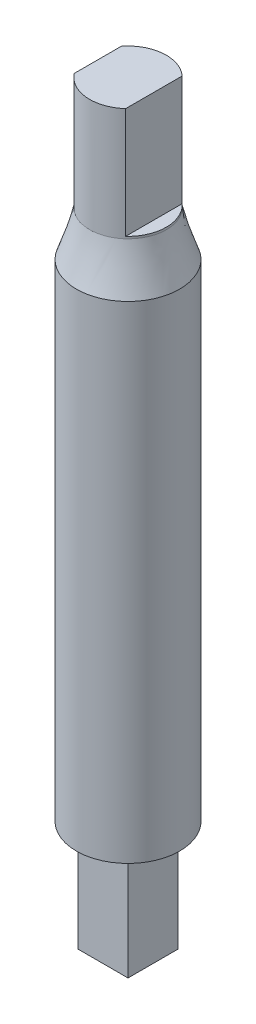
ISO-10303-21;
HEADER;
FILE_DESCRIPTION(('STEP AP214'),'2;1');
FILE_NAME('part.step','',(''),(''),'','','');
FILE_SCHEMA(('AUTOMOTIVE_DESIGN { 1 0 10303 214 1 1 1 1 }'));
ENDSEC;
DATA;
#1=APPLICATION_CONTEXT('core data for automotive mechanical design processes');
#2=APPLICATION_PROTOCOL_DEFINITION('international standard','automotive_design',2000,#1);
#3=PRODUCT_CONTEXT('',#1,'mechanical');
#4=PRODUCT('Part','Part','',(#3));
#5=PRODUCT_RELATED_PRODUCT_CATEGORY('part','',(#4));
#6=PRODUCT_DEFINITION_FORMATION('','',#4);
#7=PRODUCT_DEFINITION_CONTEXT('part definition',#1,'design');
#8=PRODUCT_DEFINITION('design','',#6,#7);
#9=PRODUCT_DEFINITION_SHAPE('','',#8);
#10=(LENGTH_UNIT() NAMED_UNIT(*) SI_UNIT(.MILLI.,.METRE.));
#11=(NAMED_UNIT(*) PLANE_ANGLE_UNIT() SI_UNIT($,.RADIAN.));
#12=(NAMED_UNIT(*) SI_UNIT($,.STERADIAN.) SOLID_ANGLE_UNIT());
#13=UNCERTAINTY_MEASURE_WITH_UNIT(LENGTH_MEASURE(1.E-05),#10,'distance_accuracy_value','');
#14=(GEOMETRIC_REPRESENTATION_CONTEXT(3) GLOBAL_UNCERTAINTY_ASSIGNED_CONTEXT((#13)) GLOBAL_UNIT_ASSIGNED_CONTEXT((#10,
#11,#12)) REPRESENTATION_CONTEXT('',''));
#15=CARTESIAN_POINT('',(0.,0.,0.));
#16=DIRECTION('',(0.,0.,1.));
#17=DIRECTION('',(1.,0.,0.));
#18=AXIS2_PLACEMENT_3D('',#15,#16,#17);
#19=CARTESIAN_POINT('',(0.,0.,0.));
#20=DIRECTION('',(0.,1.,0.));
#21=DIRECTION('',(0.,0.,1.));
#22=AXIS2_PLACEMENT_3D('',#19,#20,#21);
#23=PLANE('',#22);
#24=CARTESIAN_POINT('',(0.,0.,0.));
#25=DIRECTION('',(0.,1.,0.));
#26=DIRECTION('',(0.,0.,1.));
#27=AXIS2_PLACEMENT_3D('',#24,#25,#26);
#28=CIRCLE('',#27,3.5);
#29=CARTESIAN_POINT('',(0.,0.,3.5));
#30=VERTEX_POINT('',#29);
#31=EDGE_CURVE('E53',#30,#30,#28,.T.);
#32=ORIENTED_EDGE('',*,*,#31,.F.);
#33=EDGE_LOOP('',(#32));
#34=FACE_BOUND('',#33,.T.);
#35=DIRECTION('',(0.,0.,1.));
#36=VECTOR('',#35,1.);
#37=CARTESIAN_POINT('',(1.7,0.,1.7));
#38=LINE('',#37,#36);
#39=CARTESIAN_POINT('',(1.7,0.,-1.7));
#40=VERTEX_POINT('',#39);
#41=CARTESIAN_POINT('',(1.7,0.,1.7));
#42=VERTEX_POINT('',#41);
#43=EDGE_CURVE('E60',#40,#42,#38,.T.);
#44=ORIENTED_EDGE('',*,*,#43,.F.);
#45=DIRECTION('',(1.,0.,0.));
#46=VECTOR('',#45,1.);
#47=CARTESIAN_POINT('',(-1.7,0.,-1.7));
#48=LINE('',#47,#46);
#49=CARTESIAN_POINT('',(-1.7,0.,-1.7));
#50=VERTEX_POINT('',#49);
#51=EDGE_CURVE('E64',#50,#40,#48,.T.);
#52=ORIENTED_EDGE('',*,*,#51,.F.);
#53=DIRECTION('',(0.,0.,-1.));
#54=VECTOR('',#53,1.);
#55=CARTESIAN_POINT('',(-1.7,0.,1.7));
#56=LINE('',#55,#54);
#57=CARTESIAN_POINT('',(-1.7,0.,1.7));
#58=VERTEX_POINT('',#57);
#59=EDGE_CURVE('E333',#58,#50,#56,.T.);
#60=ORIENTED_EDGE('',*,*,#59,.F.);
#61=DIRECTION('',(-1.,0.,0.));
#62=VECTOR('',#61,1.);
#63=CARTESIAN_POINT('',(-1.7,0.,1.7));
#64=LINE('',#63,#62);
#65=EDGE_CURVE('E339',#42,#58,#64,.T.);
#66=ORIENTED_EDGE('',*,*,#65,.F.);
#67=EDGE_LOOP('',(#44,#52,#60,#66));
#68=FACE_BOUND('',#67,.T.);
#69=ADVANCED_FACE('F44',(#34,#68),#23,.F.);
#70=CARTESIAN_POINT('',(0.,36.19,0.));
#71=DIRECTION('',(0.,1.,0.));
#72=DIRECTION('',(0.,0.,1.));
#73=AXIS2_PLACEMENT_3D('',#70,#71,#72);
#74=PLANE('',#73);
#75=CARTESIAN_POINT('',(0.,36.19,0.));
#76=DIRECTION('',(0.,1.,0.));
#77=DIRECTION('',(0.,0.,1.));
#78=AXIS2_PLACEMENT_3D('',#75,#76,#77);
#79=CIRCLE('',#78,2.6);
#80=CARTESIAN_POINT('',(1.75818565571523,36.19,1.91540679753342));
#81=VERTEX_POINT('',#80);
#82=CARTESIAN_POINT('',(1.75818565571523,36.19,-1.91540679753342));
#83=VERTEX_POINT('',#82);
#84=EDGE_CURVE('E159',#81,#83,#79,.T.);
#85=ORIENTED_EDGE('',*,*,#84,.T.);
#86=DIRECTION('',(0.,0.,-1.));
#87=VECTOR('',#86,1.);
#88=CARTESIAN_POINT('',(1.75818565571523,36.19,1.91540679753342));
#89=LINE('',#88,#87);
#90=EDGE_CURVE('E143',#81,#83,#89,.T.);
#91=ORIENTED_EDGE('',*,*,#90,.F.);
#92=EDGE_LOOP('',(#85,#91));
#93=FACE_BOUND('',#92,.T.);
#94=ADVANCED_FACE('F183',(#93),#74,.T.);
#95=CARTESIAN_POINT('',(0.,36.19,0.));
#96=DIRECTION('',(0.,-1.,0.));
#97=DIRECTION('',(0.,0.,-1.));
#98=AXIS2_PLACEMENT_3D('',#95,#96,#97);
#99=CYLINDRICAL_SURFACE('',#98,2.6);
#100=CARTESIAN_POINT('',(0.,36.0399588896741,0.));
#101=DIRECTION('',(0.,1.,0.));
#102=DIRECTION('',(0.,0.,1.));
#103=AXIS2_PLACEMENT_3D('',#100,#101,#102);
#104=CIRCLE('',#103,2.6);
#105=CARTESIAN_POINT('',(1.40755948208582,36.0399588896741,2.1860412403224));
#106=VERTEX_POINT('',#105);
#107=EDGE_CURVE('E130',#106,#106,#104,.T.);
#108=ORIENTED_EDGE('',*,*,#107,.T.);
#109=EDGE_LOOP('',(#108));
#110=FACE_BOUND('',#109,.T.);
#111=ORIENTED_EDGE('',*,*,#84,.F.);
#112=DIRECTION('',(0.,-1.,0.));
#113=VECTOR('',#112,1.);
#114=CARTESIAN_POINT('',(1.75818565571523,43.69,1.91540679753342));
#115=LINE('',#114,#113);
#116=CARTESIAN_POINT('',(1.75818565571523,43.69,1.91540679753342));
#117=VERTEX_POINT('',#116);
#118=EDGE_CURVE('E169',#117,#81,#115,.T.);
#119=ORIENTED_EDGE('',*,*,#118,.F.);
#120=CARTESIAN_POINT('',(0.,43.69,0.));
#121=DIRECTION('',(0.,1.,0.));
#122=DIRECTION('',(0.,0.,1.));
#123=AXIS2_PLACEMENT_3D('',#120,#121,#122);
#124=CIRCLE('',#123,2.6);
#125=CARTESIAN_POINT('',(-2.05181434428477,43.69,1.59689007028889));
#126=VERTEX_POINT('',#125);
#127=EDGE_CURVE('E145',#126,#117,#124,.T.);
#128=ORIENTED_EDGE('',*,*,#127,.F.);
#129=DIRECTION('',(0.,-1.,0.));
#130=VECTOR('',#129,1.);
#131=CARTESIAN_POINT('',(-2.05181434428477,43.69,1.59689007028889));
#132=LINE('',#131,#130);
#133=CARTESIAN_POINT('',(-2.05181434428477,36.19,1.59689007028889));
#134=VERTEX_POINT('',#133);
#135=EDGE_CURVE('E166',#126,#134,#132,.T.);
#136=ORIENTED_EDGE('',*,*,#135,.T.);
#137=CARTESIAN_POINT('',(-2.05181434428477,36.19,-1.59689007028889));
#138=VERTEX_POINT('',#137);
#139=EDGE_CURVE('E162',#138,#134,#79,.T.);
#140=ORIENTED_EDGE('',*,*,#139,.F.);
#141=DIRECTION('',(0.,-1.,0.));
#142=VECTOR('',#141,1.);
#143=CARTESIAN_POINT('',(-2.05181434428477,43.69,-1.59689007028889));
#144=LINE('',#143,#142);
#145=CARTESIAN_POINT('',(-2.05181434428477,43.69,-1.59689007028889));
#146=VERTEX_POINT('',#145);
#147=EDGE_CURVE('E163',#146,#138,#144,.T.);
#148=ORIENTED_EDGE('',*,*,#147,.F.);
#149=CARTESIAN_POINT('',(0.,43.69,0.));
#150=DIRECTION('',(0.,1.,0.));
#151=DIRECTION('',(0.,0.,1.));
#152=AXIS2_PLACEMENT_3D('',#149,#150,#151);
#153=CIRCLE('',#152,2.6);
#154=CARTESIAN_POINT('',(1.75818565571523,43.69,-1.91540679753342));
#155=VERTEX_POINT('',#154);
#156=EDGE_CURVE('E139',#155,#146,#153,.T.);
#157=ORIENTED_EDGE('',*,*,#156,.F.);
#158=DIRECTION('',(0.,-1.,0.));
#159=VECTOR('',#158,1.);
#160=CARTESIAN_POINT('',(1.75818565571523,43.69,-1.91540679753342));
#161=LINE('',#160,#159);
#162=EDGE_CURVE('E149',#155,#83,#161,.T.);
#163=ORIENTED_EDGE('',*,*,#162,.T.);
#164=EDGE_LOOP('',(#111,#119,#128,#136,#140,#148,#157,#163));
#165=FACE_BOUND('',#164,.T.);
#166=ADVANCED_FACE('F176',(#110,#165),#99,.T.);
#167=ORIENTED_EDGE('',*,*,#139,.T.);
#168=DIRECTION('',(0.,0.,1.));
#169=VECTOR('',#168,1.);
#170=CARTESIAN_POINT('',(-2.05181434428477,36.19,-1.59689007028889));
#171=LINE('',#170,#169);
#172=EDGE_CURVE('E133',#138,#134,#171,.T.);
#173=ORIENTED_EDGE('',*,*,#172,.F.);
#174=EDGE_LOOP('',(#167,#173));
#175=FACE_BOUND('',#174,.T.);
#176=ADVANCED_FACE('F186',(#175),#74,.T.);
#177=CARTESIAN_POINT('',(-2.05181434428477,43.69,-1.59689007028889));
#178=DIRECTION('',(1.,0.,0.));
#179=DIRECTION('',(0.,0.,-1.));
#180=AXIS2_PLACEMENT_3D('',#177,#178,#179);
#181=PLANE('',#180);
#182=ORIENTED_EDGE('',*,*,#172,.T.);
#183=ORIENTED_EDGE('',*,*,#135,.F.);
#184=DIRECTION('',(0.,0.,1.));
#185=VECTOR('',#184,1.);
#186=CARTESIAN_POINT('',(-2.05181434428477,43.69,-1.59689007028889));
#187=LINE('',#186,#185);
#188=EDGE_CURVE('E142',#146,#126,#187,.T.);
#189=ORIENTED_EDGE('',*,*,#188,.F.);
#190=ORIENTED_EDGE('',*,*,#147,.T.);
#191=EDGE_LOOP('',(#182,#183,#189,#190));
#192=FACE_BOUND('',#191,.T.);
#193=ADVANCED_FACE('F197',(#192),#181,.F.);
#194=CARTESIAN_POINT('',(1.75818565571523,43.69,1.91540679753342));
#195=DIRECTION('',(-1.,0.,0.));
#196=DIRECTION('',(0.,0.,1.));
#197=AXIS2_PLACEMENT_3D('',#194,#195,#196);
#198=PLANE('',#197);
#199=ORIENTED_EDGE('',*,*,#90,.T.);
#200=ORIENTED_EDGE('',*,*,#162,.F.);
#201=DIRECTION('',(0.,0.,-1.));
#202=VECTOR('',#201,1.);
#203=CARTESIAN_POINT('',(1.75818565571523,43.69,1.91540679753342));
#204=LINE('',#203,#202);
#205=EDGE_CURVE('E147',#117,#155,#204,.T.);
#206=ORIENTED_EDGE('',*,*,#205,.F.);
#207=ORIENTED_EDGE('',*,*,#118,.T.);
#208=EDGE_LOOP('',(#199,#200,#206,#207));
#209=FACE_BOUND('',#208,.T.);
#210=ADVANCED_FACE('F181',(#209),#198,.F.);
#211=CARTESIAN_POINT('',(0.,43.69,0.));
#212=DIRECTION('',(0.,1.,0.));
#213=DIRECTION('',(0.,0.,1.));
#214=AXIS2_PLACEMENT_3D('',#211,#212,#213);
#215=PLANE('',#214);
#216=ORIENTED_EDGE('',*,*,#156,.T.);
#217=ORIENTED_EDGE('',*,*,#188,.T.);
#218=ORIENTED_EDGE('',*,*,#127,.T.);
#219=ORIENTED_EDGE('',*,*,#205,.T.);
#220=EDGE_LOOP('',(#216,#217,#218,#219));
#221=FACE_BOUND('',#220,.T.);
#222=ADVANCED_FACE('F208',(#221),#215,.T.);
#223=CARTESIAN_POINT('',(0.603918100609763,33.,3.44750386914299));
#224=CARTESIAN_POINT('',(1.44722424386601,36.19,2.12378011761257));
#225=CARTESIAN_POINT('',(7.49892583889575,33.,2.23966766792346));
#226=CARTESIAN_POINT('',(5.69478447909114,36.19,-0.770668370119461));
#227=CARTESIAN_POINT('',(6.29108963767622,33.,-4.65534007036252));
#228=CARTESIAN_POINT('',(2.80033599135912,36.19,-5.01822860534459));
#229=CARTESIAN_POINT('',(-0.603918100609763,33.,-3.44750386914299));
#230=CARTESIAN_POINT('',(-1.44722424386601,36.19,-2.12378011761257));
#231=CARTESIAN_POINT('',(-7.49892583889575,33.,-2.23966766792347));
#232=CARTESIAN_POINT('',(-5.69478447909115,36.19,0.770668370119462));
#233=CARTESIAN_POINT('',(-6.29108963767622,33.,4.65534007036252));
#234=CARTESIAN_POINT('',(-2.80033599135912,36.19,5.0182286053446));
#235=CARTESIAN_POINT('',(0.603918100609763,33.,3.44750386914299));
#236=CARTESIAN_POINT('',(1.44722424386601,36.19,2.12378011761257));
#237=(BOUNDED_SURFACE() B_SPLINE_SURFACE(3,1,((#223,#224),(#225,#226),(#227,#228),(#229,#230),
(#231,#232),(#233,#234),(#235,#236)),.UNSPECIFIED.,.T.,.F.,.F.) B_SPLINE_SURFACE_WITH_KNOTS((4,
3,4),(2,2),(0.,0.5,1.),(0.,1.),
.UNSPECIFIED.) GEOMETRIC_REPRESENTATION_ITEM() RATIONAL_B_SPLINE_SURFACE(((1.,1.),
(0.333333333333333,0.333333333333333),(0.333333333333333,0.333333333333333),(1.,1.),
(0.333333333333333,0.333333333333333),(0.333333333333333,0.333333333333333),(1.,1.))) REPRESENTATION_ITEM('') SURFACE());
#238=CARTESIAN_POINT('',(0.,33.,0.));
#239=DIRECTION('',(0.,-1.,0.));
#240=DIRECTION('',(0.,0.,-1.));
#241=AXIS2_PLACEMENT_3D('',#238,#239,#240);
#242=CIRCLE('',#241,3.5);
#243=CARTESIAN_POINT('',(0.603918100609763,33.,3.44750386914299));
#244=VERTEX_POINT('',#243);
#245=EDGE_CURVE('E12',#244,#244,#242,.F.);
#246=CARTESIAN_POINT('',(0.603918100609763,33.,3.44750386914299));
#247=CARTESIAN_POINT('',(0.612289365000139,33.0316662384341,3.43436363342611));
#248=CARTESIAN_POINT('',(0.620660629390515,33.0633324768682,3.42122339770923));
#249=CARTESIAN_POINT('',(0.637403158171266,33.1266649537364,3.39494292627547));
#250=CARTESIAN_POINT('',(0.645774422561641,33.1583311921705,3.38180269055859));
#251=CARTESIAN_POINT('',(0.662516951342393,33.2216636690387,3.35552221912482));
#252=CARTESIAN_POINT('',(0.670888215732768,33.2533299074728,3.34238198340794));
#253=CARTESIAN_POINT('',(0.68763074451352,33.3166623843411,3.31610151197418));
#254=CARTESIAN_POINT('',(0.696002008903895,33.3483286227752,3.3029612762573));
#255=CARTESIAN_POINT('',(0.712744537684646,33.4116610996434,3.27668080482354));
#256=CARTESIAN_POINT('',(0.721115802075022,33.4433273380775,3.26354056910666));
#257=CARTESIAN_POINT('',(0.737858330855773,33.5066598149457,3.23726009767289));
#258=CARTESIAN_POINT('',(0.746229595246149,33.5383260533798,3.22411986195601));
#259=CARTESIAN_POINT('',(0.7629721240269,33.601658530248,3.19783939052225));
#260=CARTESIAN_POINT('',(0.771343388417276,33.6333247686821,3.18469915480537));
#261=CARTESIAN_POINT('',(0.788085917198027,33.6966572455503,3.15841868337161));
#262=CARTESIAN_POINT('',(0.796457181588402,33.7283234839844,3.14527844765473));
#263=CARTESIAN_POINT('',(0.813199710369154,33.7916559608526,3.11899797622096));
#264=CARTESIAN_POINT('',(0.821570974759529,33.8233221992867,3.10585774050408));
#265=CARTESIAN_POINT('',(0.838313503540281,33.8866546761549,3.07957726907032));
#266=CARTESIAN_POINT('',(0.846684767930657,33.9183209145891,3.06643703335344));
#267=CARTESIAN_POINT('',(0.863427296711407,33.9816533914573,3.04015656191968));
#268=CARTESIAN_POINT('',(0.871798561101782,34.0133196298914,3.0270163262028));
#269=CARTESIAN_POINT('',(0.888541089882534,34.0766521067596,3.00073585476903));
#270=CARTESIAN_POINT('',(0.89691235427291,34.1083183451937,2.98759561905215));
#271=CARTESIAN_POINT('',(0.913654883053662,34.1716508220619,2.96131514761839));
#272=CARTESIAN_POINT('',(0.922026147444036,34.203317060496,2.94817491190151));
#273=CARTESIAN_POINT('',(0.938768676224788,34.2666495373642,2.92189444046775));
#274=CARTESIAN_POINT('',(0.947139940615164,34.2983157757983,2.90875420475086));
#275=CARTESIAN_POINT('',(0.963882469395915,34.3616482526665,2.8824737333171));
#276=CARTESIAN_POINT('',(0.97225373378629,34.3933144911006,2.86933349760022));
#277=CARTESIAN_POINT('',(0.988996262567041,34.4566469679689,2.84305302616646));
#278=CARTESIAN_POINT('',(0.997367526957418,34.4883132064029,2.82991279044958));
#279=CARTESIAN_POINT('',(1.01411005573817,34.5516456832712,2.80363231901581));
#280=CARTESIAN_POINT('',(1.02248132012854,34.5833119217053,2.79049208329893));
#281=CARTESIAN_POINT('',(1.0392238489093,34.6466443985735,2.76421161186517));
#282=CARTESIAN_POINT('',(1.04759511329967,34.6783106370076,2.75107137614829));
#283=CARTESIAN_POINT('',(1.06433764208042,34.7416431138758,2.72479090471453));
#284=CARTESIAN_POINT('',(1.0727089064708,34.7733093523099,2.71165066899765));
#285=CARTESIAN_POINT('',(1.08945143525155,34.8366418291781,2.68537019756388));
#286=CARTESIAN_POINT('',(1.09782269964192,34.8683080676122,2.672229961847));
#287=CARTESIAN_POINT('',(1.11456522842268,34.9316405444804,2.64594949041324));
#288=CARTESIAN_POINT('',(1.12293649281305,34.9633067829145,2.63280925469636));
#289=CARTESIAN_POINT('',(1.1396790215938,35.0266392597827,2.6065287832626));
#290=CARTESIAN_POINT('',(1.14805028598418,35.0583054982168,2.59338854754572));
#291=CARTESIAN_POINT('',(1.16479281476493,35.1216379750851,2.56710807611195));
#292=CARTESIAN_POINT('',(1.17316407915531,35.1533042135192,2.55396784039507));
#293=CARTESIAN_POINT('',(1.18990660793606,35.2166366903874,2.52768736896131));
#294=CARTESIAN_POINT('',(1.19827787232643,35.2483029288215,2.51454713324443));
#295=CARTESIAN_POINT('',(1.21502040110718,35.3116354056897,2.48826666181067));
#296=CARTESIAN_POINT('',(1.22339166549756,35.3433016441238,2.47512642609379));
#297=CARTESIAN_POINT('',(1.24013419427831,35.406634120992,2.44884595466002));
#298=CARTESIAN_POINT('',(1.24850545866869,35.4383003594261,2.43570571894314));
#299=CARTESIAN_POINT('',(1.26524798744944,35.5016328362943,2.40942524750938));
#300=CARTESIAN_POINT('',(1.27361925183981,35.5332990747284,2.3962850117925));
#301=CARTESIAN_POINT('',(1.29036178062056,35.5966315515966,2.37000454035874));
#302=CARTESIAN_POINT('',(1.29873304501094,35.6282977900307,2.35686430464186));
#303=CARTESIAN_POINT('',(1.31547557379169,35.691630266899,2.33058383320809));
#304=CARTESIAN_POINT('',(1.32384683818207,35.7232965053331,2.31744359749121));
#305=CARTESIAN_POINT('',(1.34058936696282,35.7866289822013,2.29116312605745));
#306=CARTESIAN_POINT('',(1.34896063135319,35.8182952206354,2.27802289034057));
#307=CARTESIAN_POINT('',(1.36570316013394,35.8816276975036,2.25174241890681));
#308=CARTESIAN_POINT('',(1.37407442452432,35.9132939359377,2.23860218318993));
#309=CARTESIAN_POINT('',(1.39081695330507,35.9766264128059,2.21232171175616));
#310=CARTESIAN_POINT('',(1.39918821769545,36.00829265124,2.19918147603928));
#311=CARTESIAN_POINT('',(1.40755948208582,36.0399588896741,2.1860412403224));
#312=B_SPLINE_CURVE_WITH_KNOTS('',3,(#246,#247,#248,#249,#250,#251,#252,#253,#254,#255,#256,
#257,#258,#259,#260,#261,#262,#263,#264,#265,#266,#267,#268,#269,#270,#271,#272,#273,#274,#275,
#276,#277,#278,#279,#280,#281,#282,#283,#284,#285,#286,#287,#288,#289,#290,#291,#292,#293,#294,
#295,#296,#297,#298,#299,#300,#301,#302,#303,#304,#305,#306,#307,#308,#309,#310,#311),
.UNSPECIFIED.,.F.,.F.,(4,2,2,2,2,2,2,2,2,2,2,2,2,2,2,2,2,2,2,2,2,2,2,2,2,2,2,2,2,2,2,2,4),(0.,
0.105874693240592,0.211749386481184,0.317624079721776,0.423498772962368,0.52937346620296,
0.635248159443553,0.741122852684145,0.846997545924737,0.952872239165323,1.05874693240591,
1.16462162564651,1.2704963188871,1.3763710121277,1.48224570536828,1.58812039860888,
1.69399509184947,1.79986978509007,1.90574447833065,2.01161917157124,2.11749386481184,
2.22336855805243,2.32924325129302,2.43511794453361,2.5409926377742,2.6468673310148,
2.75274202425539,2.85861671749598,2.96449141073657,3.07036610397716,3.17624079721776,
3.28211549045835,3.38799018369893),.UNSPECIFIED.);
#313=EDGE_CURVE('BSEAM209',#244,#106,#312,.T.);
#314=ORIENTED_EDGE('',*,*,#245,.T.);
#315=ORIENTED_EDGE('',*,*,#107,.F.);
#316=ORIENTED_EDGE('',*,*,#313,.T.);
#317=ORIENTED_EDGE('',*,*,#313,.F.);
#318=EDGE_LOOP('',(#314,#316,#315,#317));
#319=FACE_BOUND('',#318,.T.);
#320=ADVANCED_FACE('F209',(#319),#237,.T.);
#321=CARTESIAN_POINT('',(0.,33.,0.));
#322=DIRECTION('',(0.,-1.,0.));
#323=DIRECTION('',(0.,0.,-1.));
#324=AXIS2_PLACEMENT_3D('',#321,#322,#323);
#325=CYLINDRICAL_SURFACE('',#324,3.5);
#326=ORIENTED_EDGE('',*,*,#245,.F.);
#327=EDGE_LOOP('',(#326));
#328=FACE_BOUND('',#327,.T.);
#329=ORIENTED_EDGE('',*,*,#31,.T.);
#330=EDGE_LOOP('',(#329));
#331=FACE_BOUND('',#330,.T.);
#332=ADVANCED_FACE('F46',(#328,#331),#325,.T.);
#333=CARTESIAN_POINT('',(1.7,-7.5,1.7));
#334=DIRECTION('',(-1.,0.,0.));
#335=DIRECTION('',(0.,0.,1.));
#336=AXIS2_PLACEMENT_3D('',#333,#334,#335);
#337=PLANE('',#336);
#338=ORIENTED_EDGE('',*,*,#43,.T.);
#339=DIRECTION('',(0.,1.,0.));
#340=VECTOR('',#339,1.);
#341=CARTESIAN_POINT('',(1.7,-7.5,1.7));
#342=LINE('',#341,#340);
#343=CARTESIAN_POINT('',(1.7,-7.5,1.7));
#344=VERTEX_POINT('',#343);
#345=EDGE_CURVE('E113',#344,#42,#342,.T.);
#346=ORIENTED_EDGE('',*,*,#345,.F.);
#347=DIRECTION('',(0.,0.,1.));
#348=VECTOR('',#347,1.);
#349=CARTESIAN_POINT('',(1.7,-7.5,1.7));
#350=LINE('',#349,#348);
#351=CARTESIAN_POINT('',(1.7,-7.5,-1.7));
#352=VERTEX_POINT('',#351);
#353=EDGE_CURVE('E119',#352,#344,#350,.T.);
#354=ORIENTED_EDGE('',*,*,#353,.F.);
#355=DIRECTION('',(0.,1.,0.));
#356=VECTOR('',#355,1.);
#357=CARTESIAN_POINT('',(1.7,-7.5,-1.7));
#358=LINE('',#357,#356);
#359=EDGE_CURVE('E331',#352,#40,#358,.T.);
#360=ORIENTED_EDGE('',*,*,#359,.T.);
#361=EDGE_LOOP('',(#338,#346,#354,#360));
#362=FACE_BOUND('',#361,.T.);
#363=ADVANCED_FACE('F129',(#362),#337,.F.);
#364=CARTESIAN_POINT('',(-1.7,-7.5,1.7));
#365=DIRECTION('',(0.,0.,-1.));
#366=DIRECTION('',(-1.,0.,0.));
#367=AXIS2_PLACEMENT_3D('',#364,#365,#366);
#368=PLANE('',#367);
#369=ORIENTED_EDGE('',*,*,#65,.T.);
#370=DIRECTION('',(0.,1.,0.));
#371=VECTOR('',#370,1.);
#372=CARTESIAN_POINT('',(-1.7,-7.5,1.7));
#373=LINE('',#372,#371);
#374=CARTESIAN_POINT('',(-1.7,-7.5,1.7));
#375=VERTEX_POINT('',#374);
#376=EDGE_CURVE('E115',#375,#58,#373,.T.);
#377=ORIENTED_EDGE('',*,*,#376,.F.);
#378=DIRECTION('',(-1.,0.,0.));
#379=VECTOR('',#378,1.);
#380=CARTESIAN_POINT('',(-1.7,-7.5,1.7));
#381=LINE('',#380,#379);
#382=EDGE_CURVE('E108',#344,#375,#381,.T.);
#383=ORIENTED_EDGE('',*,*,#382,.F.);
#384=ORIENTED_EDGE('',*,*,#345,.T.);
#385=EDGE_LOOP('',(#369,#377,#383,#384));
#386=FACE_BOUND('',#385,.T.);
#387=ADVANCED_FACE('F111',(#386),#368,.F.);
#388=CARTESIAN_POINT('',(-1.7,-7.5,1.7));
#389=DIRECTION('',(1.,0.,0.));
#390=DIRECTION('',(0.,0.,-1.));
#391=AXIS2_PLACEMENT_3D('',#388,#389,#390);
#392=PLANE('',#391);
#393=ORIENTED_EDGE('',*,*,#59,.T.);
#394=DIRECTION('',(0.,1.,0.));
#395=VECTOR('',#394,1.);
#396=CARTESIAN_POINT('',(-1.7,-7.5,-1.7));
#397=LINE('',#396,#395);
#398=CARTESIAN_POINT('',(-1.7,-7.5,-1.7));
#399=VERTEX_POINT('',#398);
#400=EDGE_CURVE('E135',#399,#50,#397,.T.);
#401=ORIENTED_EDGE('',*,*,#400,.F.);
#402=DIRECTION('',(0.,0.,-1.));
#403=VECTOR('',#402,1.);
#404=CARTESIAN_POINT('',(-1.7,-7.5,1.7));
#405=LINE('',#404,#403);
#406=EDGE_CURVE('E118',#375,#399,#405,.T.);
#407=ORIENTED_EDGE('',*,*,#406,.F.);
#408=ORIENTED_EDGE('',*,*,#376,.T.);
#409=EDGE_LOOP('',(#393,#401,#407,#408));
#410=FACE_BOUND('',#409,.T.);
#411=ADVANCED_FACE('F230',(#410),#392,.F.);
#412=CARTESIAN_POINT('',(-1.7,-7.5,-1.7));
#413=DIRECTION('',(0.,0.,1.));
#414=DIRECTION('',(1.,0.,0.));
#415=AXIS2_PLACEMENT_3D('',#412,#413,#414);
#416=PLANE('',#415);
#417=ORIENTED_EDGE('',*,*,#51,.T.);
#418=ORIENTED_EDGE('',*,*,#359,.F.);
#419=DIRECTION('',(1.,0.,0.));
#420=VECTOR('',#419,1.);
#421=CARTESIAN_POINT('',(-1.7,-7.5,-1.7));
#422=LINE('',#421,#420);
#423=EDGE_CURVE('E124',#399,#352,#422,.T.);
#424=ORIENTED_EDGE('',*,*,#423,.F.);
#425=ORIENTED_EDGE('',*,*,#400,.T.);
#426=EDGE_LOOP('',(#417,#418,#424,#425));
#427=FACE_BOUND('',#426,.T.);
#428=ADVANCED_FACE('F233',(#427),#416,.F.);
#429=CARTESIAN_POINT('',(0.,-7.5,0.));
#430=DIRECTION('',(0.,-1.,0.));
#431=DIRECTION('',(0.,0.,-1.));
#432=AXIS2_PLACEMENT_3D('',#429,#430,#431);
#433=PLANE('',#432);
#434=ORIENTED_EDGE('',*,*,#353,.T.);
#435=ORIENTED_EDGE('',*,*,#382,.T.);
#436=ORIENTED_EDGE('',*,*,#406,.T.);
#437=ORIENTED_EDGE('',*,*,#423,.T.);
#438=EDGE_LOOP('',(#434,#435,#436,#437));
#439=FACE_BOUND('',#438,.T.);
#440=ADVANCED_FACE('F122',(#439),#433,.T.);
#441=CLOSED_SHELL('',(#69,#94,#166,#176,#193,#210,#222,#320,#332,#363,#387,#411,#428,#440));
#442=MANIFOLD_SOLID_BREP('B2',#441);
#443=ADVANCED_BREP_SHAPE_REPRESENTATION('',(#18,#442),#14);
#444=SHAPE_DEFINITION_REPRESENTATION(#9,#443);
ENDSEC;
END-ISO-10303-21;
